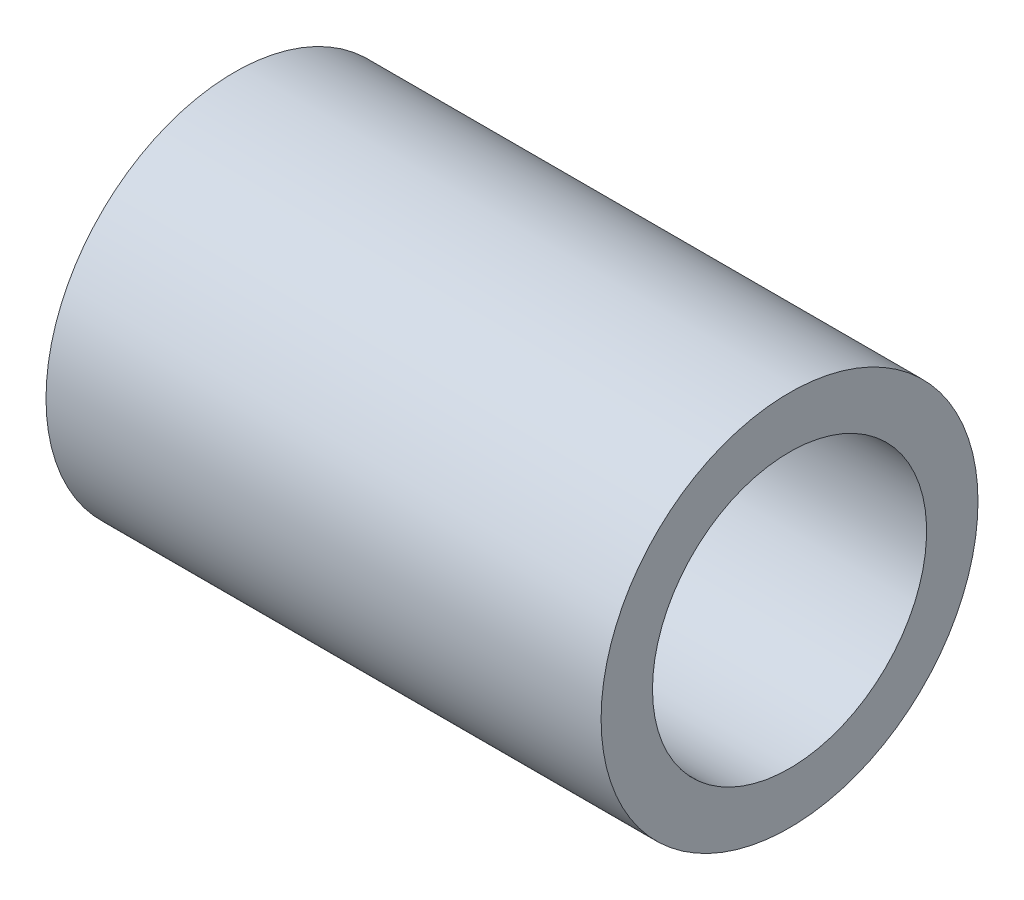
ISO-10303-21;
HEADER;
FILE_DESCRIPTION(('STEP AP214'),'2;1');
FILE_NAME('part.step','',(''),(''),'','','');
FILE_SCHEMA(('AUTOMOTIVE_DESIGN { 1 0 10303 214 1 1 1 1 }'));
ENDSEC;
DATA;
#1=APPLICATION_CONTEXT('core data for automotive mechanical design processes');
#2=APPLICATION_PROTOCOL_DEFINITION('international standard','automotive_design',2000,#1);
#3=PRODUCT_CONTEXT('',#1,'mechanical');
#4=PRODUCT('Part','Part','',(#3));
#5=PRODUCT_RELATED_PRODUCT_CATEGORY('part','',(#4));
#6=PRODUCT_DEFINITION_FORMATION('','',#4);
#7=PRODUCT_DEFINITION_CONTEXT('part definition',#1,'design');
#8=PRODUCT_DEFINITION('design','',#6,#7);
#9=PRODUCT_DEFINITION_SHAPE('','',#8);
#10=(LENGTH_UNIT() NAMED_UNIT(*) SI_UNIT(.MILLI.,.METRE.));
#11=(NAMED_UNIT(*) PLANE_ANGLE_UNIT() SI_UNIT($,.RADIAN.));
#12=(NAMED_UNIT(*) SI_UNIT($,.STERADIAN.) SOLID_ANGLE_UNIT());
#13=UNCERTAINTY_MEASURE_WITH_UNIT(LENGTH_MEASURE(1.E-05),#10,'distance_accuracy_value','');
#14=(GEOMETRIC_REPRESENTATION_CONTEXT(3) GLOBAL_UNCERTAINTY_ASSIGNED_CONTEXT((#13)) GLOBAL_UNIT_ASSIGNED_CONTEXT((#10,
#11,#12)) REPRESENTATION_CONTEXT('',''));
#15=CARTESIAN_POINT('',(0.,0.,0.));
#16=DIRECTION('',(0.,0.,1.));
#17=DIRECTION('',(1.,0.,0.));
#18=AXIS2_PLACEMENT_3D('',#15,#16,#17);
#19=CARTESIAN_POINT('',(0.,0.,0.));
#20=DIRECTION('',(1.,0.,0.));
#21=DIRECTION('',(0.,0.,-1.));
#22=AXIS2_PLACEMENT_3D('',#19,#20,#21);
#23=PLANE('',#22);
#24=CARTESIAN_POINT('',(0.,0.,0.));
#25=DIRECTION('',(-1.,0.,0.));
#26=DIRECTION('',(0.,0.,1.));
#27=AXIS2_PLACEMENT_3D('',#24,#25,#26);
#28=CIRCLE('',#27,5.5);
#29=CARTESIAN_POINT('',(0.,0.,5.5));
#30=VERTEX_POINT('',#29);
#31=EDGE_CURVE('E10',#30,#30,#28,.T.);
#32=ORIENTED_EDGE('',*,*,#31,.T.);
#33=EDGE_LOOP('',(#32));
#34=FACE_BOUND('',#33,.T.);
#35=CARTESIAN_POINT('',(0.,0.,0.));
#36=DIRECTION('',(-1.,0.,0.));
#37=DIRECTION('',(0.,0.,1.));
#38=AXIS2_PLACEMENT_3D('',#35,#36,#37);
#39=CIRCLE('',#38,4.);
#40=CARTESIAN_POINT('',(0.,0.,4.));
#41=VERTEX_POINT('',#40);
#42=EDGE_CURVE('E40',#41,#41,#39,.T.);
#43=ORIENTED_EDGE('',*,*,#42,.F.);
#44=EDGE_LOOP('',(#43));
#45=FACE_BOUND('',#44,.T.);
#46=ADVANCED_FACE('F30',(#34,#45),#23,.F.);
#47=CARTESIAN_POINT('',(16.2,0.,0.));
#48=DIRECTION('',(-1.,0.,0.));
#49=DIRECTION('',(0.,0.,1.));
#50=AXIS2_PLACEMENT_3D('',#47,#48,#49);
#51=PLANE('',#50);
#52=CARTESIAN_POINT('',(16.2,0.,0.));
#53=DIRECTION('',(-1.,0.,0.));
#54=DIRECTION('',(0.,0.,1.));
#55=AXIS2_PLACEMENT_3D('',#52,#53,#54);
#56=CIRCLE('',#55,5.5);
#57=CARTESIAN_POINT('',(16.2,0.,5.5));
#58=VERTEX_POINT('',#57);
#59=EDGE_CURVE('E36',#58,#58,#56,.T.);
#60=ORIENTED_EDGE('',*,*,#59,.F.);
#61=EDGE_LOOP('',(#60));
#62=FACE_BOUND('',#61,.T.);
#63=CARTESIAN_POINT('',(16.2,0.,0.));
#64=DIRECTION('',(-1.,0.,0.));
#65=DIRECTION('',(0.,0.,1.));
#66=AXIS2_PLACEMENT_3D('',#63,#64,#65);
#67=CIRCLE('',#66,4.);
#68=CARTESIAN_POINT('',(16.2,0.,4.));
#69=VERTEX_POINT('',#68);
#70=EDGE_CURVE('E44',#69,#69,#67,.T.);
#71=ORIENTED_EDGE('',*,*,#70,.T.);
#72=EDGE_LOOP('',(#71));
#73=FACE_BOUND('',#72,.T.);
#74=ADVANCED_FACE('F50',(#62,#73),#51,.F.);
#75=CARTESIAN_POINT('',(-3.30725721999249,0.,0.));
#76=DIRECTION('',(-1.,0.,0.));
#77=DIRECTION('',(0.,0.,1.));
#78=AXIS2_PLACEMENT_3D('',#75,#76,#77);
#79=CYLINDRICAL_SURFACE('',#78,5.5);
#80=ORIENTED_EDGE('',*,*,#31,.F.);
#81=EDGE_LOOP('',(#80));
#82=FACE_BOUND('',#81,.T.);
#83=ORIENTED_EDGE('',*,*,#59,.T.);
#84=EDGE_LOOP('',(#83));
#85=FACE_BOUND('',#84,.T.);
#86=ADVANCED_FACE('F54',(#82,#85),#79,.T.);
#87=CARTESIAN_POINT('',(-3.05392755931504,0.,0.));
#88=DIRECTION('',(-1.,0.,0.));
#89=DIRECTION('',(0.,0.,1.));
#90=AXIS2_PLACEMENT_3D('',#87,#88,#89);
#91=CYLINDRICAL_SURFACE('',#90,4.);
#92=ORIENTED_EDGE('',*,*,#42,.T.);
#93=EDGE_LOOP('',(#92));
#94=FACE_BOUND('',#93,.T.);
#95=ORIENTED_EDGE('',*,*,#70,.F.);
#96=EDGE_LOOP('',(#95));
#97=FACE_BOUND('',#96,.T.);
#98=ADVANCED_FACE('F52',(#94,#97),#91,.F.);
#99=CLOSED_SHELL('',(#46,#74,#86,#98));
#100=MANIFOLD_SOLID_BREP('B2',#99);
#101=ADVANCED_BREP_SHAPE_REPRESENTATION('',(#18,#100),#14);
#102=SHAPE_DEFINITION_REPRESENTATION(#9,#101);
ENDSEC;
END-ISO-10303-21;
